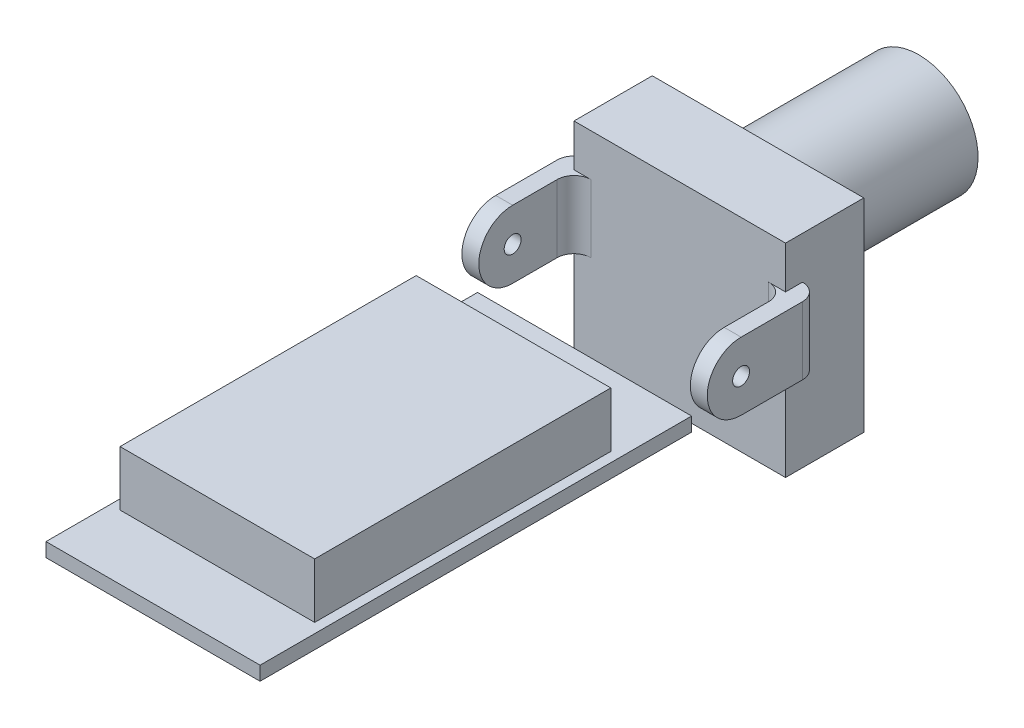
ISO-10303-21;
HEADER;
FILE_DESCRIPTION(('STEP AP214'),'2;1');
FILE_NAME('part.step','',(''),(''),'','','');
FILE_SCHEMA(('AUTOMOTIVE_DESIGN { 1 0 10303 214 1 1 1 1 }'));
ENDSEC;
DATA;
#1=APPLICATION_CONTEXT('core data for automotive mechanical design processes');
#2=APPLICATION_PROTOCOL_DEFINITION('international standard','automotive_design',2000,#1);
#3=PRODUCT_CONTEXT('',#1,'mechanical');
#4=PRODUCT('Part','Part','',(#3));
#5=PRODUCT_RELATED_PRODUCT_CATEGORY('part','',(#4));
#6=PRODUCT_DEFINITION_FORMATION('','',#4);
#7=PRODUCT_DEFINITION_CONTEXT('part definition',#1,'design');
#8=PRODUCT_DEFINITION('design','',#6,#7);
#9=PRODUCT_DEFINITION_SHAPE('','',#8);
#10=(LENGTH_UNIT() NAMED_UNIT(*) SI_UNIT(.MILLI.,.METRE.));
#11=(NAMED_UNIT(*) PLANE_ANGLE_UNIT() SI_UNIT($,.RADIAN.));
#12=(NAMED_UNIT(*) SI_UNIT($,.STERADIAN.) SOLID_ANGLE_UNIT());
#13=UNCERTAINTY_MEASURE_WITH_UNIT(LENGTH_MEASURE(1.E-05),#10,'distance_accuracy_value','');
#14=(GEOMETRIC_REPRESENTATION_CONTEXT(3) GLOBAL_UNCERTAINTY_ASSIGNED_CONTEXT((#13)) GLOBAL_UNIT_ASSIGNED_CONTEXT((#10,
#11,#12)) REPRESENTATION_CONTEXT('',''));
#15=CARTESIAN_POINT('',(0.,0.,0.));
#16=DIRECTION('',(0.,0.,1.));
#17=DIRECTION('',(1.,0.,0.));
#18=AXIS2_PLACEMENT_3D('',#15,#16,#17);
#19=CARTESIAN_POINT('',(12.5,0.,0.));
#20=DIRECTION('',(1.,0.,0.));
#21=DIRECTION('',(0.,0.,-1.));
#22=AXIS2_PLACEMENT_3D('',#19,#20,#21);
#23=PLANE('',#22);
#24=DIRECTION('',(0.,-1.,0.));
#25=VECTOR('',#24,1.);
#26=CARTESIAN_POINT('',(12.5,-1.27502175484295E-13,-36.75));
#27=LINE('',#26,#25);
#28=CARTESIAN_POINT('',(12.5,13.65,-36.75));
#29=VERTEX_POINT('',#28);
#30=CARTESIAN_POINT('',(12.5,8.64999999999998,-36.75));
#31=VERTEX_POINT('',#30);
#32=EDGE_CURVE('E319',#29,#31,#27,.T.);
#33=ORIENTED_EDGE('',*,*,#32,.T.);
#34=DIRECTION('',(0.,0.,-1.));
#35=VECTOR('',#34,1.);
#36=CARTESIAN_POINT('',(12.5,8.65000000000011,0.));
#37=LINE('',#36,#35);
#38=CARTESIAN_POINT('',(12.5,8.64999999999997,-38.75));
#39=VERTEX_POINT('',#38);
#40=EDGE_CURVE('E301',#31,#39,#37,.T.);
#41=ORIENTED_EDGE('',*,*,#40,.T.);
#42=DIRECTION('',(0.,1.,0.));
#43=VECTOR('',#42,1.);
#44=CARTESIAN_POINT('',(12.5,-1.34441069388202E-13,-38.75));
#45=LINE('',#44,#43);
#46=CARTESIAN_POINT('',(12.5,0.64999999999996,-38.75));
#47=VERTEX_POINT('',#46);
#48=EDGE_CURVE('E293',#47,#39,#45,.T.);
#49=ORIENTED_EDGE('',*,*,#48,.F.);
#50=DIRECTION('',(0.,0.,1.));
#51=VECTOR('',#50,1.);
#52=CARTESIAN_POINT('',(12.5,0.650000000000096,0.));
#53=LINE('',#52,#51);
#54=CARTESIAN_POINT('',(12.5,0.64999999999997,-36.75));
#55=VERTEX_POINT('',#54);
#56=EDGE_CURVE('E297',#47,#55,#53,.T.);
#57=ORIENTED_EDGE('',*,*,#56,.T.);
#58=CARTESIAN_POINT('',(12.5,-10.35,-36.75));
#59=VERTEX_POINT('',#58);
#60=EDGE_CURVE('E318',#55,#59,#27,.T.);
#61=ORIENTED_EDGE('',*,*,#60,.T.);
#62=DIRECTION('',(0.,0.,1.));
#63=VECTOR('',#62,1.);
#64=CARTESIAN_POINT('',(12.5,-10.3499999999999,0.));
#65=LINE('',#64,#63);
#66=CARTESIAN_POINT('',(12.5,-10.3500000000001,-45.9999999999999));
#67=VERTEX_POINT('',#66);
#68=EDGE_CURVE('E306',#67,#59,#65,.T.);
#69=ORIENTED_EDGE('',*,*,#68,.F.);
#70=DIRECTION('',(0.,-1.,0.));
#71=VECTOR('',#70,1.);
#72=CARTESIAN_POINT('',(12.5,-1.59594559789866E-13,-46.));
#73=LINE('',#72,#71);
#74=CARTESIAN_POINT('',(12.5,13.6499999999999,-46.));
#75=VERTEX_POINT('',#74);
#76=EDGE_CURVE('E310',#75,#67,#73,.T.);
#77=ORIENTED_EDGE('',*,*,#76,.F.);
#78=DIRECTION('',(0.,0.,1.));
#79=VECTOR('',#78,1.);
#80=CARTESIAN_POINT('',(12.5,13.6500000000001,0.));
#81=LINE('',#80,#79);
#82=EDGE_CURVE('E315',#75,#29,#81,.T.);
#83=ORIENTED_EDGE('',*,*,#82,.T.);
#84=EDGE_LOOP('',(#33,#41,#49,#57,#61,#69,#77,#83));
#85=FACE_BOUND('',#84,.T.);
#86=ADVANCED_FACE('F81',(#85),#23,.T.);
#87=CARTESIAN_POINT('',(-12.5,0.,0.));
#88=DIRECTION('',(1.,0.,0.));
#89=DIRECTION('',(0.,0.,-1.));
#90=AXIS2_PLACEMENT_3D('',#87,#88,#89);
#91=PLANE('',#90);
#92=DIRECTION('',(0.,0.,-1.));
#93=VECTOR('',#92,1.);
#94=CARTESIAN_POINT('',(-12.5,8.65000000000011,0.));
#95=LINE('',#94,#93);
#96=CARTESIAN_POINT('',(-12.5,8.64999999999998,-36.75));
#97=VERTEX_POINT('',#96);
#98=CARTESIAN_POINT('',(-12.5,8.64999999999997,-38.75));
#99=VERTEX_POINT('',#98);
#100=EDGE_CURVE('E358',#97,#99,#95,.T.);
#101=ORIENTED_EDGE('',*,*,#100,.F.);
#102=DIRECTION('',(0.,-1.,0.));
#103=VECTOR('',#102,1.);
#104=CARTESIAN_POINT('',(-12.5,-1.27502175484295E-13,-36.75));
#105=LINE('',#104,#103);
#106=CARTESIAN_POINT('',(-12.5,13.65,-36.75));
#107=VERTEX_POINT('',#106);
#108=EDGE_CURVE('E311',#107,#97,#105,.T.);
#109=ORIENTED_EDGE('',*,*,#108,.F.);
#110=DIRECTION('',(0.,0.,1.));
#111=VECTOR('',#110,1.);
#112=CARTESIAN_POINT('',(-12.5,13.6500000000001,0.));
#113=LINE('',#112,#111);
#114=CARTESIAN_POINT('',(-12.5,13.6499999999999,-46.));
#115=VERTEX_POINT('',#114);
#116=EDGE_CURVE('E331',#115,#107,#113,.T.);
#117=ORIENTED_EDGE('',*,*,#116,.F.);
#118=DIRECTION('',(0.,-1.,0.));
#119=VECTOR('',#118,1.);
#120=CARTESIAN_POINT('',(-12.5,-1.59594559789866E-13,-46.));
#121=LINE('',#120,#119);
#122=CARTESIAN_POINT('',(-12.5,-10.3500000000001,-45.9999999999999));
#123=VERTEX_POINT('',#122);
#124=EDGE_CURVE('E327',#115,#123,#121,.T.);
#125=ORIENTED_EDGE('',*,*,#124,.T.);
#126=DIRECTION('',(0.,0.,1.));
#127=VECTOR('',#126,1.);
#128=CARTESIAN_POINT('',(-12.5,-10.3499999999999,0.));
#129=LINE('',#128,#127);
#130=CARTESIAN_POINT('',(-12.5,-10.35,-36.75));
#131=VERTEX_POINT('',#130);
#132=EDGE_CURVE('E305',#123,#131,#129,.T.);
#133=ORIENTED_EDGE('',*,*,#132,.T.);
#134=CARTESIAN_POINT('',(-12.5,0.64999999999997,-36.75));
#135=VERTEX_POINT('',#134);
#136=EDGE_CURVE('E334',#135,#131,#105,.T.);
#137=ORIENTED_EDGE('',*,*,#136,.F.);
#138=DIRECTION('',(0.,0.,1.));
#139=VECTOR('',#138,1.);
#140=CARTESIAN_POINT('',(-12.5,0.650000000000096,0.));
#141=LINE('',#140,#139);
#142=CARTESIAN_POINT('',(-12.5,0.64999999999996,-38.75));
#143=VERTEX_POINT('',#142);
#144=EDGE_CURVE('E354',#143,#135,#141,.T.);
#145=ORIENTED_EDGE('',*,*,#144,.F.);
#146=DIRECTION('',(0.,1.,0.));
#147=VECTOR('',#146,1.);
#148=CARTESIAN_POINT('',(-12.5,-1.34441069388202E-13,-38.75));
#149=LINE('',#148,#147);
#150=EDGE_CURVE('E350',#143,#99,#149,.T.);
#151=ORIENTED_EDGE('',*,*,#150,.T.);
#152=EDGE_LOOP('',(#101,#109,#117,#125,#133,#137,#145,#151));
#153=FACE_BOUND('',#152,.T.);
#154=ADVANCED_FACE('F431',(#153),#91,.F.);
#155=CARTESIAN_POINT('',(12.5,-10.3499999999999,0.));
#156=DIRECTION('',(0.,-1.,0.));
#157=DIRECTION('',(0.,0.,-1.));
#158=AXIS2_PLACEMENT_3D('',#155,#156,#157);
#159=PLANE('',#158);
#160=ORIENTED_EDGE('',*,*,#132,.F.);
#161=DIRECTION('',(-1.,0.,0.));
#162=VECTOR('',#161,1.);
#163=CARTESIAN_POINT('',(12.5,-10.3500000000001,-45.9999999999999));
#164=LINE('',#163,#162);
#165=EDGE_CURVE('E347',#67,#123,#164,.T.);
#166=ORIENTED_EDGE('',*,*,#165,.F.);
#167=ORIENTED_EDGE('',*,*,#68,.T.);
#168=DIRECTION('',(-1.,0.,0.));
#169=VECTOR('',#168,1.);
#170=CARTESIAN_POINT('',(12.5,-10.35,-36.75));
#171=LINE('',#170,#169);
#172=EDGE_CURVE('E323',#59,#131,#171,.T.);
#173=ORIENTED_EDGE('',*,*,#172,.T.);
#174=EDGE_LOOP('',(#160,#166,#167,#173));
#175=FACE_BOUND('',#174,.T.);
#176=ADVANCED_FACE('F429',(#175),#159,.T.);
#177=CARTESIAN_POINT('',(12.5,-1.59594559789866E-13,-46.));
#178=DIRECTION('',(0.,0.,-1.));
#179=DIRECTION('',(0.,1.,0.));
#180=AXIS2_PLACEMENT_3D('',#177,#178,#179);
#181=PLANE('',#180);
#182=CARTESIAN_POINT('',(0.,5.54999999999995,-46.));
#183=DIRECTION('',(0.,0.,-1.));
#184=DIRECTION('',(0.,1.,0.));
#185=AXIS2_PLACEMENT_3D('',#182,#183,#184);
#186=CIRCLE('',#185,7.);
#187=CARTESIAN_POINT('',(0.,12.5499999999999,-46.));
#188=VERTEX_POINT('',#187);
#189=EDGE_CURVE('E13',#188,#188,#186,.T.);
#190=ORIENTED_EDGE('',*,*,#189,.F.);
#191=EDGE_LOOP('',(#190));
#192=FACE_BOUND('',#191,.T.);
#193=ORIENTED_EDGE('',*,*,#124,.F.);
#194=DIRECTION('',(-1.,0.,0.));
#195=VECTOR('',#194,1.);
#196=CARTESIAN_POINT('',(12.5,13.6499999999999,-46.));
#197=LINE('',#196,#195);
#198=EDGE_CURVE('E344',#75,#115,#197,.T.);
#199=ORIENTED_EDGE('',*,*,#198,.F.);
#200=ORIENTED_EDGE('',*,*,#76,.T.);
#201=ORIENTED_EDGE('',*,*,#165,.T.);
#202=EDGE_LOOP('',(#193,#199,#200,#201));
#203=FACE_BOUND('',#202,.T.);
#204=ADVANCED_FACE('F435',(#192,#203),#181,.T.);
#205=CARTESIAN_POINT('',(12.5,13.6500000000001,0.));
#206=DIRECTION('',(0.,-1.,0.));
#207=DIRECTION('',(0.,0.,-1.));
#208=AXIS2_PLACEMENT_3D('',#205,#206,#207);
#209=PLANE('',#208);
#210=ORIENTED_EDGE('',*,*,#116,.T.);
#211=DIRECTION('',(-1.,0.,0.));
#212=VECTOR('',#211,1.);
#213=CARTESIAN_POINT('',(12.5,13.65,-36.75));
#214=LINE('',#213,#212);
#215=EDGE_CURVE('E340',#29,#107,#214,.T.);
#216=ORIENTED_EDGE('',*,*,#215,.F.);
#217=ORIENTED_EDGE('',*,*,#82,.F.);
#218=ORIENTED_EDGE('',*,*,#198,.T.);
#219=EDGE_LOOP('',(#210,#216,#217,#218));
#220=FACE_BOUND('',#219,.T.);
#221=ADVANCED_FACE('F455',(#220),#209,.F.);
#222=CARTESIAN_POINT('',(12.5,-1.27502175484295E-13,-36.75));
#223=DIRECTION('',(0.,0.,-1.));
#224=DIRECTION('',(0.,1.,0.));
#225=AXIS2_PLACEMENT_3D('',#222,#223,#224);
#226=PLANE('',#225);
#227=DIRECTION('',(0.,1.,0.));
#228=VECTOR('',#227,1.);
#229=CARTESIAN_POINT('',(10.5,8.64999999999998,-36.75));
#230=LINE('',#229,#228);
#231=CARTESIAN_POINT('',(10.5,0.649999999999967,-36.75));
#232=VERTEX_POINT('',#231);
#233=CARTESIAN_POINT('',(10.5,8.64999999999998,-36.75));
#234=VERTEX_POINT('',#233);
#235=EDGE_CURVE('E372',#232,#234,#230,.T.);
#236=ORIENTED_EDGE('',*,*,#235,.T.);
#237=DIRECTION('',(1.,0.,0.));
#238=VECTOR('',#237,1.);
#239=CARTESIAN_POINT('',(-14.5,8.64999999999998,-36.75));
#240=LINE('',#239,#238);
#241=EDGE_CURVE('E376',#234,#31,#240,.T.);
#242=ORIENTED_EDGE('',*,*,#241,.T.);
#243=ORIENTED_EDGE('',*,*,#32,.F.);
#244=ORIENTED_EDGE('',*,*,#215,.T.);
#245=ORIENTED_EDGE('',*,*,#108,.T.);
#246=DIRECTION('',(1.,0.,0.));
#247=VECTOR('',#246,1.);
#248=CARTESIAN_POINT('',(-14.5,8.64999999999998,-36.75));
#249=LINE('',#248,#247);
#250=CARTESIAN_POINT('',(-10.5,8.64999999999998,-36.75));
#251=VERTEX_POINT('',#250);
#252=EDGE_CURVE('E98',#97,#251,#249,.T.);
#253=ORIENTED_EDGE('',*,*,#252,.T.);
#254=DIRECTION('',(0.,-1.,0.));
#255=VECTOR('',#254,1.);
#256=CARTESIAN_POINT('',(-10.5,-1.27502175484295E-13,-36.75));
#257=LINE('',#256,#255);
#258=CARTESIAN_POINT('',(-10.5,0.649999999999967,-36.75));
#259=VERTEX_POINT('',#258);
#260=EDGE_CURVE('E363',#251,#259,#257,.T.);
#261=ORIENTED_EDGE('',*,*,#260,.T.);
#262=DIRECTION('',(-1.,0.,0.));
#263=VECTOR('',#262,1.);
#264=CARTESIAN_POINT('',(-14.5,0.649999999999967,-36.75));
#265=LINE('',#264,#263);
#266=EDGE_CURVE('E367',#259,#135,#265,.T.);
#267=ORIENTED_EDGE('',*,*,#266,.T.);
#268=ORIENTED_EDGE('',*,*,#136,.T.);
#269=ORIENTED_EDGE('',*,*,#172,.F.);
#270=ORIENTED_EDGE('',*,*,#60,.F.);
#271=DIRECTION('',(-1.,0.,0.));
#272=VECTOR('',#271,1.);
#273=CARTESIAN_POINT('',(-14.5,0.649999999999967,-36.75));
#274=LINE('',#273,#272);
#275=EDGE_CURVE('E106',#55,#232,#274,.T.);
#276=ORIENTED_EDGE('',*,*,#275,.T.);
#277=EDGE_LOOP('',(#236,#242,#243,#244,#245,#253,#261,#267,#268,#269,#270,#276));
#278=FACE_BOUND('',#277,.T.);
#279=ADVANCED_FACE('F418',(#278),#226,.F.);
#280=CARTESIAN_POINT('',(-14.5,0.64999999999996,-38.75));
#281=DIRECTION('',(1.,0.,0.));
#282=DIRECTION('',(0.,1.,0.));
#283=AXIS2_PLACEMENT_3D('',#280,#281,#282);
#284=PLANE('',#283);
#285=DIRECTION('',(0.,0.,1.));
#286=VECTOR('',#285,1.);
#287=CARTESIAN_POINT('',(-14.5,8.64999999999997,-38.75));
#288=LINE('',#287,#286);
#289=CARTESIAN_POINT('',(-14.5,8.64999999999998,-36.75));
#290=VERTEX_POINT('',#289);
#291=CARTESIAN_POINT('',(-14.5,8.65,-29.5));
#292=VERTEX_POINT('',#291);
#293=EDGE_CURVE('E290',#290,#292,#288,.T.);
#294=ORIENTED_EDGE('',*,*,#293,.F.);
#295=DIRECTION('',(0.,1.,0.));
#296=VECTOR('',#295,1.);
#297=CARTESIAN_POINT('',(-14.5,0.649999999999967,-36.75));
#298=LINE('',#297,#296);
#299=CARTESIAN_POINT('',(-14.5,0.649999999999967,-36.75));
#300=VERTEX_POINT('',#299);
#301=EDGE_CURVE('E218',#290,#300,#298,.F.);
#302=ORIENTED_EDGE('',*,*,#301,.T.);
#303=DIRECTION('',(0.,0.,1.));
#304=VECTOR('',#303,1.);
#305=CARTESIAN_POINT('',(-14.5,0.64999999999996,-38.75));
#306=LINE('',#305,#304);
#307=CARTESIAN_POINT('',(-14.5,0.649999999999998,-29.5));
#308=VERTEX_POINT('',#307);
#309=EDGE_CURVE('E210',#300,#308,#306,.T.);
#310=ORIENTED_EDGE('',*,*,#309,.T.);
#311=CARTESIAN_POINT('',(-14.5,4.65,-29.5));
#312=DIRECTION('',(1.,0.,0.));
#313=DIRECTION('',(0.,0.,-1.));
#314=AXIS2_PLACEMENT_3D('',#311,#312,#313);
#315=CIRCLE('',#314,4.);
#316=EDGE_CURVE('E216',#292,#308,#315,.T.);
#317=ORIENTED_EDGE('',*,*,#316,.F.);
#318=EDGE_LOOP('',(#294,#302,#310,#317));
#319=FACE_BOUND('',#318,.T.);
#320=CARTESIAN_POINT('',(-14.5,4.65,-29.5));
#321=DIRECTION('',(1.,0.,0.));
#322=DIRECTION('',(0.,0.,-1.));
#323=AXIS2_PLACEMENT_3D('',#320,#321,#322);
#324=CIRCLE('',#323,1.);
#325=CARTESIAN_POINT('',(-14.5,4.65,-30.5));
#326=VERTEX_POINT('',#325);
#327=EDGE_CURVE('E254',#326,#326,#324,.T.);
#328=ORIENTED_EDGE('',*,*,#327,.T.);
#329=EDGE_LOOP('',(#328));
#330=FACE_BOUND('',#329,.T.);
#331=ADVANCED_FACE('F213',(#319,#330),#284,.F.);
#332=CARTESIAN_POINT('',(-14.5,0.64999999999996,-38.75));
#333=DIRECTION('',(0.,1.,0.));
#334=DIRECTION('',(0.,0.,1.));
#335=AXIS2_PLACEMENT_3D('',#332,#333,#334);
#336=PLANE('',#335);
#337=ORIENTED_EDGE('',*,*,#309,.F.);
#338=CARTESIAN_POINT('',(-12.5,0.649999999999967,-36.75));
#339=DIRECTION('',(0.,1.,0.));
#340=DIRECTION('',(0.,0.,1.));
#341=AXIS2_PLACEMENT_3D('',#338,#339,#340);
#342=CIRCLE('',#341,2.);
#343=EDGE_CURVE('E399',#300,#143,#342,.F.);
#344=ORIENTED_EDGE('',*,*,#343,.T.);
#345=ORIENTED_EDGE('',*,*,#144,.T.);
#346=ORIENTED_EDGE('',*,*,#266,.F.);
#347=CARTESIAN_POINT('',(-10.5,0.649999999999974,-34.75));
#348=DIRECTION('',(0.,1.,0.));
#349=DIRECTION('',(0.,0.,1.));
#350=AXIS2_PLACEMENT_3D('',#347,#348,#349);
#351=CIRCLE('',#350,2.);
#352=CARTESIAN_POINT('',(-12.5,0.649999999999978,-34.75));
#353=VERTEX_POINT('',#352);
#354=EDGE_CURVE('E407',#259,#353,#351,.T.);
#355=ORIENTED_EDGE('',*,*,#354,.T.);
#356=DIRECTION('',(0.,0.,-1.));
#357=VECTOR('',#356,1.);
#358=CARTESIAN_POINT('',(-12.5,0.650000000000111,0.));
#359=LINE('',#358,#357);
#360=CARTESIAN_POINT('',(-12.5,0.649999999999998,-29.5));
#361=VERTEX_POINT('',#360);
#362=EDGE_CURVE('E229',#361,#353,#359,.T.);
#363=ORIENTED_EDGE('',*,*,#362,.F.);
#364=DIRECTION('',(1.,0.,0.));
#365=VECTOR('',#364,1.);
#366=CARTESIAN_POINT('',(-14.5,0.649999999999998,-29.5));
#367=LINE('',#366,#365);
#368=EDGE_CURVE('E226',#308,#361,#367,.T.);
#369=ORIENTED_EDGE('',*,*,#368,.F.);
#370=EDGE_LOOP('',(#337,#344,#345,#346,#355,#363,#369));
#371=FACE_BOUND('',#370,.T.);
#372=ADVANCED_FACE('F227',(#371),#336,.F.);
#373=CARTESIAN_POINT('',(-14.5,8.64999999999997,-38.75));
#374=DIRECTION('',(0.,-1.,0.));
#375=DIRECTION('',(0.,0.,-1.));
#376=AXIS2_PLACEMENT_3D('',#373,#374,#375);
#377=PLANE('',#376);
#378=ORIENTED_EDGE('',*,*,#100,.T.);
#379=CARTESIAN_POINT('',(-12.5,8.64999999999998,-36.75));
#380=DIRECTION('',(0.,-1.,0.));
#381=DIRECTION('',(0.,0.,-1.));
#382=AXIS2_PLACEMENT_3D('',#379,#380,#381);
#383=CIRCLE('',#382,2.);
#384=EDGE_CURVE('E394',#99,#290,#383,.F.);
#385=ORIENTED_EDGE('',*,*,#384,.T.);
#386=ORIENTED_EDGE('',*,*,#293,.T.);
#387=DIRECTION('',(1.,0.,0.));
#388=VECTOR('',#387,1.);
#389=CARTESIAN_POINT('',(-14.5,8.65,-29.5));
#390=LINE('',#389,#388);
#391=CARTESIAN_POINT('',(-12.5,8.65,-29.5));
#392=VERTEX_POINT('',#391);
#393=EDGE_CURVE('E235',#292,#392,#390,.T.);
#394=ORIENTED_EDGE('',*,*,#393,.T.);
#395=DIRECTION('',(0.,0.,-1.));
#396=VECTOR('',#395,1.);
#397=CARTESIAN_POINT('',(-12.5,8.6500000000001,0.));
#398=LINE('',#397,#396);
#399=CARTESIAN_POINT('',(-12.5,8.64999999999998,-34.75));
#400=VERTEX_POINT('',#399);
#401=EDGE_CURVE('E240',#392,#400,#398,.T.);
#402=ORIENTED_EDGE('',*,*,#401,.T.);
#403=CARTESIAN_POINT('',(-10.5,8.64999999999999,-34.75));
#404=DIRECTION('',(0.,-1.,0.));
#405=DIRECTION('',(0.,0.,-1.));
#406=AXIS2_PLACEMENT_3D('',#403,#404,#405);
#407=CIRCLE('',#406,2.);
#408=EDGE_CURVE('E85',#400,#251,#407,.T.);
#409=ORIENTED_EDGE('',*,*,#408,.T.);
#410=ORIENTED_EDGE('',*,*,#252,.F.);
#411=EDGE_LOOP('',(#378,#385,#386,#394,#402,#409,#410));
#412=FACE_BOUND('',#411,.T.);
#413=ADVANCED_FACE('F412',(#412),#377,.F.);
#414=DIRECTION('',(0.,0.,1.));
#415=VECTOR('',#414,1.);
#416=CARTESIAN_POINT('',(14.5,8.64999999999997,-38.75));
#417=LINE('',#416,#415);
#418=CARTESIAN_POINT('',(14.5,8.64999999999998,-36.75));
#419=VERTEX_POINT('',#418);
#420=CARTESIAN_POINT('',(14.5,8.65,-29.5));
#421=VERTEX_POINT('',#420);
#422=EDGE_CURVE('E287',#419,#421,#417,.T.);
#423=ORIENTED_EDGE('',*,*,#422,.F.);
#424=CARTESIAN_POINT('',(12.5,8.64999999999998,-36.75));
#425=DIRECTION('',(0.,-1.,0.));
#426=DIRECTION('',(0.,0.,-1.));
#427=AXIS2_PLACEMENT_3D('',#424,#425,#426);
#428=CIRCLE('',#427,2.);
#429=EDGE_CURVE('E391',#419,#39,#428,.F.);
#430=ORIENTED_EDGE('',*,*,#429,.T.);
#431=ORIENTED_EDGE('',*,*,#40,.F.);
#432=ORIENTED_EDGE('',*,*,#241,.F.);
#433=CARTESIAN_POINT('',(10.5,8.64999999999999,-34.75));
#434=DIRECTION('',(0.,-1.,0.));
#435=DIRECTION('',(0.,0.,-1.));
#436=AXIS2_PLACEMENT_3D('',#433,#434,#435);
#437=CIRCLE('',#436,2.);
#438=CARTESIAN_POINT('',(12.5,8.64999999999998,-34.75));
#439=VERTEX_POINT('',#438);
#440=EDGE_CURVE('E402',#234,#439,#437,.T.);
#441=ORIENTED_EDGE('',*,*,#440,.T.);
#442=DIRECTION('',(0.,0.,1.));
#443=VECTOR('',#442,1.);
#444=CARTESIAN_POINT('',(12.5,8.6500000000001,0.));
#445=LINE('',#444,#443);
#446=CARTESIAN_POINT('',(12.5,8.65,-29.5));
#447=VERTEX_POINT('',#446);
#448=EDGE_CURVE('E270',#439,#447,#445,.T.);
#449=ORIENTED_EDGE('',*,*,#448,.T.);
#450=DIRECTION('',(-1.,0.,0.));
#451=VECTOR('',#450,1.);
#452=CARTESIAN_POINT('',(14.5,8.65,-29.5));
#453=LINE('',#452,#451);
#454=EDGE_CURVE('E223',#421,#447,#453,.T.);
#455=ORIENTED_EDGE('',*,*,#454,.F.);
#456=EDGE_LOOP('',(#423,#430,#431,#432,#441,#449,#455));
#457=FACE_BOUND('',#456,.T.);
#458=ADVANCED_FACE('F451',(#457),#377,.F.);
#459=CARTESIAN_POINT('',(14.5,0.64999999999996,-38.75));
#460=DIRECTION('',(-1.,0.,0.));
#461=DIRECTION('',(0.,0.,1.));
#462=AXIS2_PLACEMENT_3D('',#459,#460,#461);
#463=PLANE('',#462);
#464=DIRECTION('',(0.,0.,1.));
#465=VECTOR('',#464,1.);
#466=CARTESIAN_POINT('',(14.5,0.64999999999996,-38.75));
#467=LINE('',#466,#465);
#468=CARTESIAN_POINT('',(14.5,0.649999999999967,-36.75));
#469=VERTEX_POINT('',#468);
#470=CARTESIAN_POINT('',(14.5,0.649999999999998,-29.5));
#471=VERTEX_POINT('',#470);
#472=EDGE_CURVE('E222',#469,#471,#467,.T.);
#473=ORIENTED_EDGE('',*,*,#472,.F.);
#474=DIRECTION('',(0.,-1.,0.));
#475=VECTOR('',#474,1.);
#476=CARTESIAN_POINT('',(14.5,8.64999999999998,-36.75));
#477=LINE('',#476,#475);
#478=EDGE_CURVE('E388',#469,#419,#477,.F.);
#479=ORIENTED_EDGE('',*,*,#478,.T.);
#480=ORIENTED_EDGE('',*,*,#422,.T.);
#481=CARTESIAN_POINT('',(14.5,4.65,-29.5));
#482=DIRECTION('',(1.,0.,0.));
#483=DIRECTION('',(0.,0.,-1.));
#484=AXIS2_PLACEMENT_3D('',#481,#482,#483);
#485=CIRCLE('',#484,4.);
#486=EDGE_CURVE('E265',#421,#471,#485,.T.);
#487=ORIENTED_EDGE('',*,*,#486,.T.);
#488=EDGE_LOOP('',(#473,#479,#480,#487));
#489=FACE_BOUND('',#488,.T.);
#490=CARTESIAN_POINT('',(14.5,4.65,-29.5));
#491=DIRECTION('',(1.,0.,0.));
#492=DIRECTION('',(0.,0.,-1.));
#493=AXIS2_PLACEMENT_3D('',#490,#491,#492);
#494=CIRCLE('',#493,1.);
#495=CARTESIAN_POINT('',(14.5,4.65,-30.5));
#496=VERTEX_POINT('',#495);
#497=EDGE_CURVE('E257',#496,#496,#494,.T.);
#498=ORIENTED_EDGE('',*,*,#497,.F.);
#499=EDGE_LOOP('',(#498));
#500=FACE_BOUND('',#499,.T.);
#501=ADVANCED_FACE('F556',(#489,#500),#463,.F.);
#502=ORIENTED_EDGE('',*,*,#56,.F.);
#503=CARTESIAN_POINT('',(12.5,0.649999999999967,-36.75));
#504=DIRECTION('',(0.,1.,0.));
#505=DIRECTION('',(0.,0.,1.));
#506=AXIS2_PLACEMENT_3D('',#503,#504,#505);
#507=CIRCLE('',#506,2.);
#508=EDGE_CURVE('E385',#47,#469,#507,.F.);
#509=ORIENTED_EDGE('',*,*,#508,.T.);
#510=ORIENTED_EDGE('',*,*,#472,.T.);
#511=DIRECTION('',(-1.,0.,0.));
#512=VECTOR('',#511,1.);
#513=CARTESIAN_POINT('',(14.5,0.649999999999998,-29.5));
#514=LINE('',#513,#512);
#515=CARTESIAN_POINT('',(12.5,0.649999999999998,-29.5));
#516=VERTEX_POINT('',#515);
#517=EDGE_CURVE('E269',#471,#516,#514,.T.);
#518=ORIENTED_EDGE('',*,*,#517,.T.);
#519=DIRECTION('',(0.,0.,1.));
#520=VECTOR('',#519,1.);
#521=CARTESIAN_POINT('',(12.5,0.650000000000111,0.));
#522=LINE('',#521,#520);
#523=CARTESIAN_POINT('',(12.5,0.649999999999978,-34.75));
#524=VERTEX_POINT('',#523);
#525=EDGE_CURVE('E261',#524,#516,#522,.T.);
#526=ORIENTED_EDGE('',*,*,#525,.F.);
#527=CARTESIAN_POINT('',(10.5,0.649999999999974,-34.75));
#528=DIRECTION('',(0.,1.,0.));
#529=DIRECTION('',(0.,0.,1.));
#530=AXIS2_PLACEMENT_3D('',#527,#528,#529);
#531=CIRCLE('',#530,2.);
#532=EDGE_CURVE('E405',#524,#232,#531,.T.);
#533=ORIENTED_EDGE('',*,*,#532,.T.);
#534=ORIENTED_EDGE('',*,*,#275,.F.);
#535=EDGE_LOOP('',(#502,#509,#510,#518,#526,#533,#534));
#536=FACE_BOUND('',#535,.T.);
#537=ADVANCED_FACE('F549',(#536),#336,.F.);
#538=CARTESIAN_POINT('',(12.5,4.65,-29.5));
#539=DIRECTION('',(1.,0.,0.));
#540=DIRECTION('',(0.,0.,-1.));
#541=AXIS2_PLACEMENT_3D('',#538,#539,#540);
#542=PLANE('',#541);
#543=ORIENTED_EDGE('',*,*,#448,.F.);
#544=DIRECTION('',(0.,1.,0.));
#545=VECTOR('',#544,1.);
#546=CARTESIAN_POINT('',(12.5,0.649999999999977,-34.75));
#547=LINE('',#546,#545);
#548=EDGE_CURVE('E379',#439,#524,#547,.F.);
#549=ORIENTED_EDGE('',*,*,#548,.T.);
#550=ORIENTED_EDGE('',*,*,#525,.T.);
#551=CARTESIAN_POINT('',(12.5,4.65,-29.5));
#552=DIRECTION('',(1.,0.,0.));
#553=DIRECTION('',(0.,0.,-1.));
#554=AXIS2_PLACEMENT_3D('',#551,#552,#553);
#555=CIRCLE('',#554,4.);
#556=EDGE_CURVE('E273',#447,#516,#555,.T.);
#557=ORIENTED_EDGE('',*,*,#556,.F.);
#558=EDGE_LOOP('',(#543,#549,#550,#557));
#559=FACE_BOUND('',#558,.T.);
#560=CARTESIAN_POINT('',(12.5,4.65,-29.5));
#561=DIRECTION('',(1.,0.,0.));
#562=DIRECTION('',(0.,0.,-1.));
#563=AXIS2_PLACEMENT_3D('',#560,#561,#562);
#564=CIRCLE('',#563,1.);
#565=CARTESIAN_POINT('',(12.5,4.65,-30.5));
#566=VERTEX_POINT('',#565);
#567=EDGE_CURVE('E234',#566,#566,#564,.T.);
#568=ORIENTED_EDGE('',*,*,#567,.T.);
#569=EDGE_LOOP('',(#568));
#570=FACE_BOUND('',#569,.T.);
#571=ADVANCED_FACE('F546',(#559,#570),#542,.F.);
#572=CARTESIAN_POINT('',(14.5,4.65,-29.5));
#573=DIRECTION('',(-1.,0.,0.));
#574=DIRECTION('',(0.,0.,1.));
#575=AXIS2_PLACEMENT_3D('',#572,#573,#574);
#576=CYLINDRICAL_SURFACE('',#575,4.);
#577=ORIENTED_EDGE('',*,*,#556,.T.);
#578=ORIENTED_EDGE('',*,*,#517,.F.);
#579=ORIENTED_EDGE('',*,*,#486,.F.);
#580=ORIENTED_EDGE('',*,*,#454,.T.);
#581=EDGE_LOOP('',(#577,#578,#579,#580));
#582=FACE_BOUND('',#581,.T.);
#583=ADVANCED_FACE('F544',(#582),#576,.T.);
#584=CARTESIAN_POINT('',(14.5,4.65,-29.5));
#585=DIRECTION('',(-1.,0.,0.));
#586=DIRECTION('',(0.,0.,1.));
#587=AXIS2_PLACEMENT_3D('',#584,#585,#586);
#588=CYLINDRICAL_SURFACE('',#587,1.);
#589=ORIENTED_EDGE('',*,*,#497,.T.);
#590=EDGE_LOOP('',(#589));
#591=FACE_BOUND('',#590,.T.);
#592=ORIENTED_EDGE('',*,*,#567,.F.);
#593=EDGE_LOOP('',(#592));
#594=FACE_BOUND('',#593,.T.);
#595=ADVANCED_FACE('F541',(#591,#594),#588,.F.);
#596=CARTESIAN_POINT('',(-14.5,4.65,-29.5));
#597=DIRECTION('',(1.,0.,0.));
#598=DIRECTION('',(0.,0.,-1.));
#599=AXIS2_PLACEMENT_3D('',#596,#597,#598);
#600=CYLINDRICAL_SURFACE('',#599,4.);
#601=CARTESIAN_POINT('',(-12.5,4.65,-29.5));
#602=DIRECTION('',(1.,0.,0.));
#603=DIRECTION('',(0.,0.,-1.));
#604=AXIS2_PLACEMENT_3D('',#601,#602,#603);
#605=CIRCLE('',#604,4.);
#606=EDGE_CURVE('E246',#392,#361,#605,.T.);
#607=ORIENTED_EDGE('',*,*,#606,.F.);
#608=ORIENTED_EDGE('',*,*,#393,.F.);
#609=ORIENTED_EDGE('',*,*,#316,.T.);
#610=ORIENTED_EDGE('',*,*,#368,.T.);
#611=EDGE_LOOP('',(#607,#608,#609,#610));
#612=FACE_BOUND('',#611,.T.);
#613=ADVANCED_FACE('F238',(#612),#600,.T.);
#614=CARTESIAN_POINT('',(-12.5,4.65,-29.5));
#615=DIRECTION('',(1.,0.,0.));
#616=DIRECTION('',(0.,0.,-1.));
#617=AXIS2_PLACEMENT_3D('',#614,#615,#616);
#618=PLANE('',#617);
#619=CARTESIAN_POINT('',(-12.5,4.65,-29.5));
#620=DIRECTION('',(1.,0.,0.));
#621=DIRECTION('',(0.,0.,-1.));
#622=AXIS2_PLACEMENT_3D('',#619,#620,#621);
#623=CIRCLE('',#622,1.);
#624=CARTESIAN_POINT('',(-12.5,4.65,-30.5));
#625=VERTEX_POINT('',#624);
#626=EDGE_CURVE('E250',#625,#625,#623,.T.);
#627=ORIENTED_EDGE('',*,*,#626,.F.);
#628=EDGE_LOOP('',(#627));
#629=FACE_BOUND('',#628,.T.);
#630=ORIENTED_EDGE('',*,*,#362,.T.);
#631=DIRECTION('',(0.,-1.,0.));
#632=VECTOR('',#631,1.);
#633=CARTESIAN_POINT('',(-12.5,4.64999999999998,-34.75));
#634=LINE('',#633,#632);
#635=EDGE_CURVE('E382',#353,#400,#634,.F.);
#636=ORIENTED_EDGE('',*,*,#635,.T.);
#637=ORIENTED_EDGE('',*,*,#401,.F.);
#638=ORIENTED_EDGE('',*,*,#606,.T.);
#639=EDGE_LOOP('',(#630,#636,#637,#638));
#640=FACE_BOUND('',#639,.T.);
#641=ADVANCED_FACE('F534',(#629,#640),#618,.T.);
#642=CARTESIAN_POINT('',(-14.5,4.65,-29.5));
#643=DIRECTION('',(1.,0.,0.));
#644=DIRECTION('',(0.,0.,-1.));
#645=AXIS2_PLACEMENT_3D('',#642,#643,#644);
#646=CYLINDRICAL_SURFACE('',#645,1.);
#647=ORIENTED_EDGE('',*,*,#327,.F.);
#648=EDGE_LOOP('',(#647));
#649=FACE_BOUND('',#648,.T.);
#650=ORIENTED_EDGE('',*,*,#626,.T.);
#651=EDGE_LOOP('',(#650));
#652=FACE_BOUND('',#651,.T.);
#653=ADVANCED_FACE('F489',(#649,#652),#646,.F.);
#654=CARTESIAN_POINT('',(10.5,-1.20563281580388E-13,-34.75));
#655=DIRECTION('',(0.,-1.,0.));
#656=DIRECTION('',(0.,0.,-1.));
#657=AXIS2_PLACEMENT_3D('',#654,#655,#656);
#658=CYLINDRICAL_SURFACE('',#657,2.);
#659=ORIENTED_EDGE('',*,*,#532,.F.);
#660=ORIENTED_EDGE('',*,*,#548,.F.);
#661=ORIENTED_EDGE('',*,*,#440,.F.);
#662=ORIENTED_EDGE('',*,*,#235,.F.);
#663=EDGE_LOOP('',(#659,#660,#661,#662));
#664=FACE_BOUND('',#663,.T.);
#665=ADVANCED_FACE('F444',(#664),#658,.F.);
#666=CARTESIAN_POINT('',(-10.5,-1.20563281580388E-13,-34.75));
#667=DIRECTION('',(0.,-1.,0.));
#668=DIRECTION('',(0.,0.,-1.));
#669=AXIS2_PLACEMENT_3D('',#666,#667,#668);
#670=CYLINDRICAL_SURFACE('',#669,2.);
#671=ORIENTED_EDGE('',*,*,#408,.F.);
#672=ORIENTED_EDGE('',*,*,#635,.F.);
#673=ORIENTED_EDGE('',*,*,#354,.F.);
#674=ORIENTED_EDGE('',*,*,#260,.F.);
#675=EDGE_LOOP('',(#671,#672,#673,#674));
#676=FACE_BOUND('',#675,.T.);
#677=ADVANCED_FACE('F421',(#676),#670,.F.);
#678=CARTESIAN_POINT('',(12.5,-1.27546244258074E-13,-36.75));
#679=DIRECTION('',(0.,1.,0.));
#680=DIRECTION('',(0.,0.,1.));
#681=AXIS2_PLACEMENT_3D('',#678,#679,#680);
#682=CYLINDRICAL_SURFACE('',#681,2.);
#683=ORIENTED_EDGE('',*,*,#429,.F.);
#684=ORIENTED_EDGE('',*,*,#478,.F.);
#685=ORIENTED_EDGE('',*,*,#508,.F.);
#686=ORIENTED_EDGE('',*,*,#48,.T.);
#687=EDGE_LOOP('',(#683,#684,#685,#686));
#688=FACE_BOUND('',#687,.T.);
#689=ADVANCED_FACE('F460',(#688),#682,.T.);
#690=CARTESIAN_POINT('',(-12.5,-1.2483573882686E-13,-36.75));
#691=DIRECTION('',(0.,-1.,0.));
#692=DIRECTION('',(0.,0.,-1.));
#693=AXIS2_PLACEMENT_3D('',#690,#691,#692);
#694=CYLINDRICAL_SURFACE('',#693,2.);
#695=ORIENTED_EDGE('',*,*,#343,.F.);
#696=ORIENTED_EDGE('',*,*,#301,.F.);
#697=ORIENTED_EDGE('',*,*,#384,.F.);
#698=ORIENTED_EDGE('',*,*,#150,.F.);
#699=EDGE_LOOP('',(#695,#696,#697,#698));
#700=FACE_BOUND('',#699,.T.);
#701=ADVANCED_FACE('F83',(#700),#694,.T.);
#702=CARTESIAN_POINT('',(0.,5.54999999999988,-65.));
#703=DIRECTION('',(0.,0.,1.));
#704=DIRECTION('',(0.,-1.,0.));
#705=AXIS2_PLACEMENT_3D('',#702,#703,#704);
#706=CYLINDRICAL_SURFACE('',#705,7.);
#707=CARTESIAN_POINT('',(0.,5.54999999999988,-65.));
#708=DIRECTION('',(0.,0.,-1.));
#709=DIRECTION('',(0.,1.,0.));
#710=AXIS2_PLACEMENT_3D('',#707,#708,#709);
#711=CIRCLE('',#710,7.);
#712=CARTESIAN_POINT('',(0.,12.5499999999999,-65.));
#713=VERTEX_POINT('',#712);
#714=EDGE_CURVE('E709',#713,#713,#711,.T.);
#715=ORIENTED_EDGE('',*,*,#714,.F.);
#716=EDGE_LOOP('',(#715));
#717=FACE_BOUND('',#716,.T.);
#718=ORIENTED_EDGE('',*,*,#189,.T.);
#719=EDGE_LOOP('',(#718));
#720=FACE_BOUND('',#719,.T.);
#721=ADVANCED_FACE('F459',(#717,#720),#706,.T.);
#722=CARTESIAN_POINT('',(0.,5.54999999999988,-65.));
#723=DIRECTION('',(0.,0.,-1.));
#724=DIRECTION('',(0.,1.,0.));
#725=AXIS2_PLACEMENT_3D('',#722,#723,#724);
#726=PLANE('',#725);
#727=ORIENTED_EDGE('',*,*,#714,.T.);
#728=EDGE_LOOP('',(#727));
#729=FACE_BOUND('',#728,.T.);
#730=ADVANCED_FACE('F465',(#729),#726,.T.);
#731=CLOSED_SHELL('',(#86,#154,#176,#204,#221,#279,#331,#372,#413,#458,#501,#537,#571,#583,#595,
#613,#641,#653,#665,#677,#689,#701,#721,#730));
#732=MANIFOLD_SOLID_BREP('B2',#731);
#733=CARTESIAN_POINT('',(0.,1.65,0.));
#734=DIRECTION('',(0.,-1.,0.));
#735=DIRECTION('',(0.,0.,-1.));
#736=AXIS2_PLACEMENT_3D('',#733,#734,#735);
#737=PLANE('',#736);
#738=DIRECTION('',(0.,0.,-1.));
#739=VECTOR('',#738,1.);
#740=CARTESIAN_POINT('',(12.65,1.65,25.5));
#741=LINE('',#740,#739);
#742=CARTESIAN_POINT('',(12.65,1.65,25.5));
#743=VERTEX_POINT('',#742);
#744=CARTESIAN_POINT('',(12.65,1.65,-25.5));
#745=VERTEX_POINT('',#744);
#746=EDGE_CURVE('E815',#743,#745,#741,.T.);
#747=ORIENTED_EDGE('',*,*,#746,.T.);
#748=DIRECTION('',(-1.,0.,0.));
#749=VECTOR('',#748,1.);
#750=CARTESIAN_POINT('',(-12.65,1.65,-25.5));
#751=LINE('',#750,#749);
#752=CARTESIAN_POINT('',(-12.65,1.65,-25.5));
#753=VERTEX_POINT('',#752);
#754=EDGE_CURVE('E818',#745,#753,#751,.T.);
#755=ORIENTED_EDGE('',*,*,#754,.T.);
#756=DIRECTION('',(0.,0.,1.));
#757=VECTOR('',#756,1.);
#758=CARTESIAN_POINT('',(-12.65,1.65,25.5));
#759=LINE('',#758,#757);
#760=CARTESIAN_POINT('',(-12.65,1.65,25.5));
#761=VERTEX_POINT('',#760);
#762=EDGE_CURVE('E821',#753,#761,#759,.T.);
#763=ORIENTED_EDGE('',*,*,#762,.T.);
#764=DIRECTION('',(1.,0.,0.));
#765=VECTOR('',#764,1.);
#766=CARTESIAN_POINT('',(-12.65,1.65,25.5));
#767=LINE('',#766,#765);
#768=EDGE_CURVE('E823',#761,#743,#767,.T.);
#769=ORIENTED_EDGE('',*,*,#768,.T.);
#770=EDGE_LOOP('',(#747,#755,#763,#769));
#771=FACE_BOUND('',#770,.T.);
#772=DIRECTION('',(0.,0.,-1.));
#773=VECTOR('',#772,1.);
#774=CARTESIAN_POINT('',(11.5,1.65,17.9));
#775=LINE('',#774,#773);
#776=CARTESIAN_POINT('',(11.5,1.65,17.9));
#777=VERTEX_POINT('',#776);
#778=CARTESIAN_POINT('',(11.5,1.65,-17.1));
#779=VERTEX_POINT('',#778);
#780=EDGE_CURVE('E736',#777,#779,#775,.T.);
#781=ORIENTED_EDGE('',*,*,#780,.F.);
#782=DIRECTION('',(1.,0.,0.));
#783=VECTOR('',#782,1.);
#784=CARTESIAN_POINT('',(-11.5,1.65,17.9));
#785=LINE('',#784,#783);
#786=CARTESIAN_POINT('',(-11.5,1.65,17.9));
#787=VERTEX_POINT('',#786);
#788=EDGE_CURVE('E740',#787,#777,#785,.T.);
#789=ORIENTED_EDGE('',*,*,#788,.F.);
#790=DIRECTION('',(0.,0.,1.));
#791=VECTOR('',#790,1.);
#792=CARTESIAN_POINT('',(-11.5,1.65,17.9));
#793=LINE('',#792,#791);
#794=CARTESIAN_POINT('',(-11.5,1.65,-17.1));
#795=VERTEX_POINT('',#794);
#796=EDGE_CURVE('E948',#795,#787,#793,.T.);
#797=ORIENTED_EDGE('',*,*,#796,.F.);
#798=DIRECTION('',(-1.,0.,0.));
#799=VECTOR('',#798,1.);
#800=CARTESIAN_POINT('',(-11.5,1.65,-17.1));
#801=LINE('',#800,#799);
#802=EDGE_CURVE('E954',#779,#795,#801,.T.);
#803=ORIENTED_EDGE('',*,*,#802,.F.);
#804=EDGE_LOOP('',(#781,#789,#797,#803));
#805=FACE_BOUND('',#804,.T.);
#806=ADVANCED_FACE('F721',(#771,#805),#737,.F.);
#807=CARTESIAN_POINT('',(12.65,1.65,25.5));
#808=DIRECTION('',(-1.,0.,0.));
#809=DIRECTION('',(0.,0.,1.));
#810=AXIS2_PLACEMENT_3D('',#807,#808,#809);
#811=PLANE('',#810);
#812=DIRECTION('',(0.,0.,-1.));
#813=VECTOR('',#812,1.);
#814=CARTESIAN_POINT('',(12.65,0.,25.5));
#815=LINE('',#814,#813);
#816=CARTESIAN_POINT('',(12.65,0.,25.5));
#817=VERTEX_POINT('',#816);
#818=CARTESIAN_POINT('',(12.65,0.,-25.5));
#819=VERTEX_POINT('',#818);
#820=EDGE_CURVE('E806',#817,#819,#815,.T.);
#821=ORIENTED_EDGE('',*,*,#820,.T.);
#822=DIRECTION('',(0.,-1.,0.));
#823=VECTOR('',#822,1.);
#824=CARTESIAN_POINT('',(12.65,1.65,-25.5));
#825=LINE('',#824,#823);
#826=EDGE_CURVE('E79',#745,#819,#825,.T.);
#827=ORIENTED_EDGE('',*,*,#826,.F.);
#828=ORIENTED_EDGE('',*,*,#746,.F.);
#829=DIRECTION('',(0.,-1.,0.));
#830=VECTOR('',#829,1.);
#831=CARTESIAN_POINT('',(12.65,1.65,25.5));
#832=LINE('',#831,#830);
#833=EDGE_CURVE('E824',#743,#817,#832,.T.);
#834=ORIENTED_EDGE('',*,*,#833,.T.);
#835=EDGE_LOOP('',(#821,#827,#828,#834));
#836=FACE_BOUND('',#835,.T.);
#837=ADVANCED_FACE('F723',(#836),#811,.F.);
#838=CARTESIAN_POINT('',(-12.65,1.65,-25.5));
#839=DIRECTION('',(0.,0.,1.));
#840=DIRECTION('',(1.,0.,0.));
#841=AXIS2_PLACEMENT_3D('',#838,#839,#840);
#842=PLANE('',#841);
#843=DIRECTION('',(-1.,0.,0.));
#844=VECTOR('',#843,1.);
#845=CARTESIAN_POINT('',(-12.65,0.,-25.5));
#846=LINE('',#845,#844);
#847=CARTESIAN_POINT('',(-12.65,0.,-25.5));
#848=VERTEX_POINT('',#847);
#849=EDGE_CURVE('E809',#819,#848,#846,.T.);
#850=ORIENTED_EDGE('',*,*,#849,.T.);
#851=DIRECTION('',(0.,-1.,0.));
#852=VECTOR('',#851,1.);
#853=CARTESIAN_POINT('',(-12.65,1.65,-25.5));
#854=LINE('',#853,#852);
#855=EDGE_CURVE('E729',#753,#848,#854,.T.);
#856=ORIENTED_EDGE('',*,*,#855,.F.);
#857=ORIENTED_EDGE('',*,*,#754,.F.);
#858=ORIENTED_EDGE('',*,*,#826,.T.);
#859=EDGE_LOOP('',(#850,#856,#857,#858));
#860=FACE_BOUND('',#859,.T.);
#861=ADVANCED_FACE('F854',(#860),#842,.F.);
#862=CARTESIAN_POINT('',(-12.65,1.65,25.5));
#863=DIRECTION('',(1.,0.,0.));
#864=DIRECTION('',(0.,0.,-1.));
#865=AXIS2_PLACEMENT_3D('',#862,#863,#864);
#866=PLANE('',#865);
#867=DIRECTION('',(0.,0.,1.));
#868=VECTOR('',#867,1.);
#869=CARTESIAN_POINT('',(-12.65,0.,25.5));
#870=LINE('',#869,#868);
#871=CARTESIAN_POINT('',(-12.65,0.,25.5));
#872=VERTEX_POINT('',#871);
#873=EDGE_CURVE('E827',#848,#872,#870,.T.);
#874=ORIENTED_EDGE('',*,*,#873,.T.);
#875=DIRECTION('',(0.,-1.,0.));
#876=VECTOR('',#875,1.);
#877=CARTESIAN_POINT('',(-12.65,1.65,25.5));
#878=LINE('',#877,#876);
#879=EDGE_CURVE('E832',#761,#872,#878,.T.);
#880=ORIENTED_EDGE('',*,*,#879,.F.);
#881=ORIENTED_EDGE('',*,*,#762,.F.);
#882=ORIENTED_EDGE('',*,*,#855,.T.);
#883=EDGE_LOOP('',(#874,#880,#881,#882));
#884=FACE_BOUND('',#883,.T.);
#885=ADVANCED_FACE('F839',(#884),#866,.F.);
#886=CARTESIAN_POINT('',(-12.65,1.65,25.5));
#887=DIRECTION('',(0.,0.,-1.));
#888=DIRECTION('',(-1.,0.,0.));
#889=AXIS2_PLACEMENT_3D('',#886,#887,#888);
#890=PLANE('',#889);
#891=DIRECTION('',(1.,0.,0.));
#892=VECTOR('',#891,1.);
#893=CARTESIAN_POINT('',(-12.65,0.,25.5));
#894=LINE('',#893,#892);
#895=EDGE_CURVE('E819',#872,#817,#894,.T.);
#896=ORIENTED_EDGE('',*,*,#895,.T.);
#897=ORIENTED_EDGE('',*,*,#833,.F.);
#898=ORIENTED_EDGE('',*,*,#768,.F.);
#899=ORIENTED_EDGE('',*,*,#879,.T.);
#900=EDGE_LOOP('',(#896,#897,#898,#899));
#901=FACE_BOUND('',#900,.T.);
#902=ADVANCED_FACE('F848',(#901),#890,.F.);
#903=CARTESIAN_POINT('',(0.,0.,0.));
#904=DIRECTION('',(0.,-1.,0.));
#905=DIRECTION('',(0.,0.,-1.));
#906=AXIS2_PLACEMENT_3D('',#903,#904,#905);
#907=PLANE('',#906);
#908=ORIENTED_EDGE('',*,*,#820,.F.);
#909=ORIENTED_EDGE('',*,*,#895,.F.);
#910=ORIENTED_EDGE('',*,*,#873,.F.);
#911=ORIENTED_EDGE('',*,*,#849,.F.);
#912=EDGE_LOOP('',(#908,#909,#910,#911));
#913=FACE_BOUND('',#912,.T.);
#914=ADVANCED_FACE('F845',(#913),#907,.T.);
#915=CARTESIAN_POINT('',(11.5,8.15,17.9));
#916=DIRECTION('',(-1.,0.,0.));
#917=DIRECTION('',(0.,0.,1.));
#918=AXIS2_PLACEMENT_3D('',#915,#916,#917);
#919=PLANE('',#918);
#920=ORIENTED_EDGE('',*,*,#780,.T.);
#921=DIRECTION('',(0.,-1.,0.));
#922=VECTOR('',#921,1.);
#923=CARTESIAN_POINT('',(11.5,8.15,-17.1));
#924=LINE('',#923,#922);
#925=CARTESIAN_POINT('',(11.5,8.15,-17.1));
#926=VERTEX_POINT('',#925);
#927=EDGE_CURVE('E789',#926,#779,#924,.T.);
#928=ORIENTED_EDGE('',*,*,#927,.F.);
#929=DIRECTION('',(0.,0.,-1.));
#930=VECTOR('',#929,1.);
#931=CARTESIAN_POINT('',(11.5,8.15,17.9));
#932=LINE('',#931,#930);
#933=CARTESIAN_POINT('',(11.5,8.15,17.9));
#934=VERTEX_POINT('',#933);
#935=EDGE_CURVE('E795',#934,#926,#932,.T.);
#936=ORIENTED_EDGE('',*,*,#935,.F.);
#937=DIRECTION('',(0.,-1.,0.));
#938=VECTOR('',#937,1.);
#939=CARTESIAN_POINT('',(11.5,8.15,17.9));
#940=LINE('',#939,#938);
#941=EDGE_CURVE('E946',#934,#777,#940,.T.);
#942=ORIENTED_EDGE('',*,*,#941,.T.);
#943=EDGE_LOOP('',(#920,#928,#936,#942));
#944=FACE_BOUND('',#943,.T.);
#945=ADVANCED_FACE('F805',(#944),#919,.F.);
#946=CARTESIAN_POINT('',(-11.5,8.15,-17.1));
#947=DIRECTION('',(0.,0.,1.));
#948=DIRECTION('',(1.,0.,0.));
#949=AXIS2_PLACEMENT_3D('',#946,#947,#948);
#950=PLANE('',#949);
#951=ORIENTED_EDGE('',*,*,#802,.T.);
#952=DIRECTION('',(0.,-1.,0.));
#953=VECTOR('',#952,1.);
#954=CARTESIAN_POINT('',(-11.5,8.15,-17.1));
#955=LINE('',#954,#953);
#956=CARTESIAN_POINT('',(-11.5,8.15,-17.1));
#957=VERTEX_POINT('',#956);
#958=EDGE_CURVE('E791',#957,#795,#955,.T.);
#959=ORIENTED_EDGE('',*,*,#958,.F.);
#960=DIRECTION('',(-1.,0.,0.));
#961=VECTOR('',#960,1.);
#962=CARTESIAN_POINT('',(-11.5,8.15,-17.1));
#963=LINE('',#962,#961);
#964=EDGE_CURVE('E784',#926,#957,#963,.T.);
#965=ORIENTED_EDGE('',*,*,#964,.F.);
#966=ORIENTED_EDGE('',*,*,#927,.T.);
#967=EDGE_LOOP('',(#951,#959,#965,#966));
#968=FACE_BOUND('',#967,.T.);
#969=ADVANCED_FACE('F787',(#968),#950,.F.);
#970=CARTESIAN_POINT('',(-11.5,8.15,17.9));
#971=DIRECTION('',(1.,0.,0.));
#972=DIRECTION('',(0.,0.,-1.));
#973=AXIS2_PLACEMENT_3D('',#970,#971,#972);
#974=PLANE('',#973);
#975=ORIENTED_EDGE('',*,*,#796,.T.);
#976=DIRECTION('',(0.,-1.,0.));
#977=VECTOR('',#976,1.);
#978=CARTESIAN_POINT('',(-11.5,8.15,17.9));
#979=LINE('',#978,#977);
#980=CARTESIAN_POINT('',(-11.5,8.15,17.9));
#981=VERTEX_POINT('',#980);
#982=EDGE_CURVE('E811',#981,#787,#979,.T.);
#983=ORIENTED_EDGE('',*,*,#982,.F.);
#984=DIRECTION('',(0.,0.,1.));
#985=VECTOR('',#984,1.);
#986=CARTESIAN_POINT('',(-11.5,8.15,17.9));
#987=LINE('',#986,#985);
#988=EDGE_CURVE('E794',#957,#981,#987,.T.);
#989=ORIENTED_EDGE('',*,*,#988,.F.);
#990=ORIENTED_EDGE('',*,*,#958,.T.);
#991=EDGE_LOOP('',(#975,#983,#989,#990));
#992=FACE_BOUND('',#991,.T.);
#993=ADVANCED_FACE('F890',(#992),#974,.F.);
#994=CARTESIAN_POINT('',(-11.5,8.15,17.9));
#995=DIRECTION('',(0.,0.,-1.));
#996=DIRECTION('',(-1.,0.,0.));
#997=AXIS2_PLACEMENT_3D('',#994,#995,#996);
#998=PLANE('',#997);
#999=ORIENTED_EDGE('',*,*,#788,.T.);
#1000=ORIENTED_EDGE('',*,*,#941,.F.);
#1001=DIRECTION('',(1.,0.,0.));
#1002=VECTOR('',#1001,1.);
#1003=CARTESIAN_POINT('',(-11.5,8.15,17.9));
#1004=LINE('',#1003,#1002);
#1005=EDGE_CURVE('E800',#981,#934,#1004,.T.);
#1006=ORIENTED_EDGE('',*,*,#1005,.F.);
#1007=ORIENTED_EDGE('',*,*,#982,.T.);
#1008=EDGE_LOOP('',(#999,#1000,#1006,#1007));
#1009=FACE_BOUND('',#1008,.T.);
#1010=ADVANCED_FACE('F896',(#1009),#998,.F.);
#1011=CARTESIAN_POINT('',(0.,8.15,0.));
#1012=DIRECTION('',(0.,-1.,0.));
#1013=DIRECTION('',(0.,0.,-1.));
#1014=AXIS2_PLACEMENT_3D('',#1011,#1012,#1013);
#1015=PLANE('',#1014);
#1016=ORIENTED_EDGE('',*,*,#935,.T.);
#1017=ORIENTED_EDGE('',*,*,#964,.T.);
#1018=ORIENTED_EDGE('',*,*,#988,.T.);
#1019=ORIENTED_EDGE('',*,*,#1005,.T.);
#1020=EDGE_LOOP('',(#1016,#1017,#1018,#1019));
#1021=FACE_BOUND('',#1020,.T.);
#1022=ADVANCED_FACE('F798',(#1021),#1015,.F.);
#1023=CLOSED_SHELL('',(#806,#837,#861,#885,#902,#914,#945,#969,#993,#1010,#1022));
#1024=MANIFOLD_SOLID_BREP('B7',#1023);
#1025=ADVANCED_BREP_SHAPE_REPRESENTATION('',(#18,#732,#1024),#14);
#1026=SHAPE_DEFINITION_REPRESENTATION(#9,#1025);
ENDSEC;
END-ISO-10303-21;
